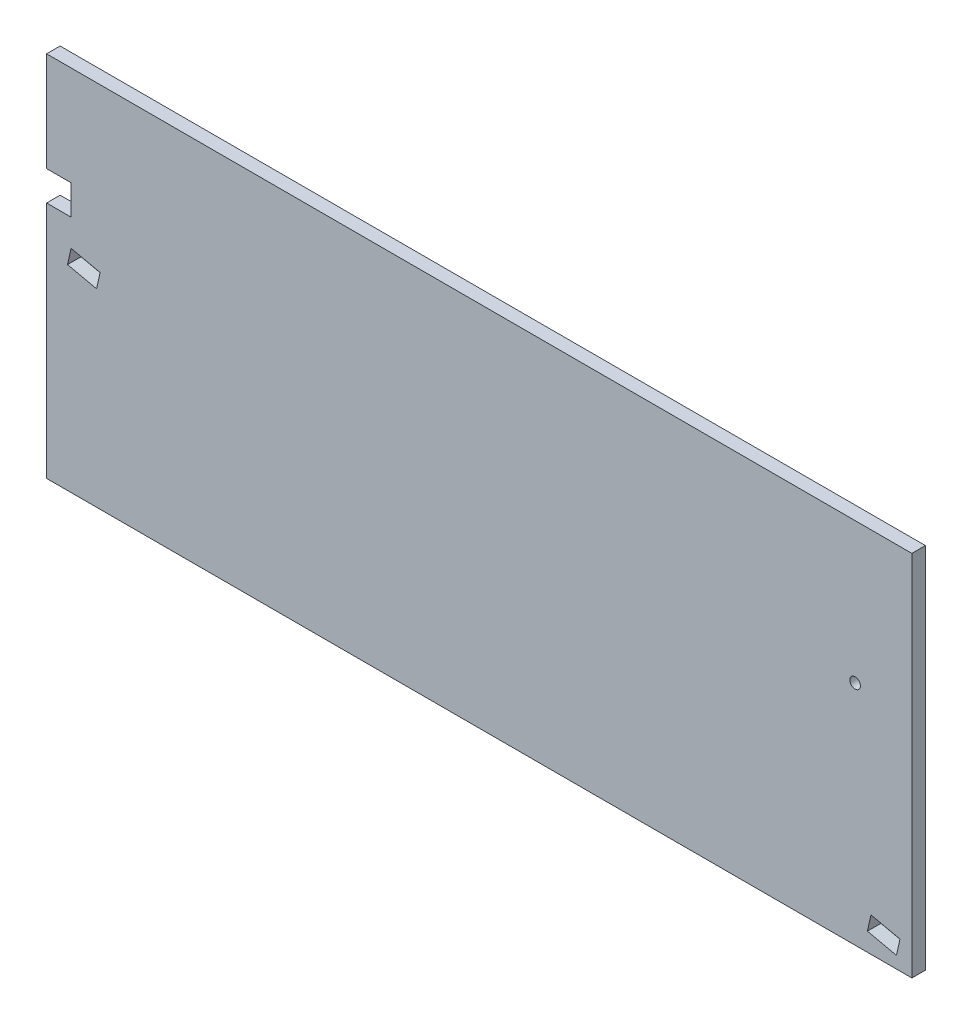
ISO-10303-21;
HEADER;
FILE_DESCRIPTION(('STEP AP214'),'2;1');
FILE_NAME('part.step','',(''),(''),'','','');
FILE_SCHEMA(('AUTOMOTIVE_DESIGN { 1 0 10303 214 1 1 1 1 }'));
ENDSEC;
DATA;
#1=APPLICATION_CONTEXT('core data for automotive mechanical design processes');
#2=APPLICATION_PROTOCOL_DEFINITION('international standard','automotive_design',2000,#1);
#3=PRODUCT_CONTEXT('',#1,'mechanical');
#4=PRODUCT('Part','Part','',(#3));
#5=PRODUCT_RELATED_PRODUCT_CATEGORY('part','',(#4));
#6=PRODUCT_DEFINITION_FORMATION('','',#4);
#7=PRODUCT_DEFINITION_CONTEXT('part definition',#1,'design');
#8=PRODUCT_DEFINITION('design','',#6,#7);
#9=PRODUCT_DEFINITION_SHAPE('','',#8);
#10=(LENGTH_UNIT() NAMED_UNIT(*) SI_UNIT(.MILLI.,.METRE.));
#11=(NAMED_UNIT(*) PLANE_ANGLE_UNIT() SI_UNIT($,.RADIAN.));
#12=(NAMED_UNIT(*) SI_UNIT($,.STERADIAN.) SOLID_ANGLE_UNIT());
#13=UNCERTAINTY_MEASURE_WITH_UNIT(LENGTH_MEASURE(1.E-05),#10,'distance_accuracy_value','');
#14=(GEOMETRIC_REPRESENTATION_CONTEXT(3) GLOBAL_UNCERTAINTY_ASSIGNED_CONTEXT((#13)) GLOBAL_UNIT_ASSIGNED_CONTEXT((#10,
#11,#12)) REPRESENTATION_CONTEXT('',''));
#15=CARTESIAN_POINT('',(0.,0.,0.));
#16=DIRECTION('',(0.,0.,1.));
#17=DIRECTION('',(1.,0.,0.));
#18=AXIS2_PLACEMENT_3D('',#15,#16,#17);
#19=CARTESIAN_POINT('',(-101.6,86.36,3.175));
#20=DIRECTION('',(1.,0.,0.));
#21=DIRECTION('',(0.,0.,-1.));
#22=AXIS2_PLACEMENT_3D('',#19,#20,#21);
#23=PLANE('',#22);
#24=DIRECTION('',(0.,-1.,0.));
#25=VECTOR('',#24,1.);
#26=CARTESIAN_POINT('',(-101.6,86.36,3.175));
#27=LINE('',#26,#25);
#28=CARTESIAN_POINT('',(-101.6,56.0195824102454,3.175));
#29=VERTEX_POINT('',#28);
#30=CARTESIAN_POINT('',(-101.6,0.,3.175));
#31=VERTEX_POINT('',#30);
#32=EDGE_CURVE('E253',#29,#31,#27,.T.);
#33=ORIENTED_EDGE('',*,*,#32,.F.);
#34=DIRECTION('',(0.,0.,1.));
#35=VECTOR('',#34,1.);
#36=CARTESIAN_POINT('',(-101.6,56.0195824102454,0.));
#37=LINE('',#36,#35);
#38=CARTESIAN_POINT('',(-101.6,56.0195824102454,0.));
#39=VERTEX_POINT('',#38);
#40=EDGE_CURVE('E177',#39,#29,#37,.T.);
#41=ORIENTED_EDGE('',*,*,#40,.F.);
#42=DIRECTION('',(0.,-1.,0.));
#43=VECTOR('',#42,1.);
#44=CARTESIAN_POINT('',(-101.6,86.36,0.));
#45=LINE('',#44,#43);
#46=CARTESIAN_POINT('',(-101.6,0.,0.));
#47=VERTEX_POINT('',#46);
#48=EDGE_CURVE('E246',#39,#47,#45,.T.);
#49=ORIENTED_EDGE('',*,*,#48,.T.);
#50=DIRECTION('',(0.,0.,-1.));
#51=VECTOR('',#50,1.);
#52=CARTESIAN_POINT('',(-101.6,0.,3.175));
#53=LINE('',#52,#51);
#54=EDGE_CURVE('E11',#31,#47,#53,.T.);
#55=ORIENTED_EDGE('',*,*,#54,.F.);
#56=EDGE_LOOP('',(#33,#41,#49,#55));
#57=FACE_BOUND('',#56,.T.);
#58=ADVANCED_FACE('F33',(#57),#23,.F.);
#59=CARTESIAN_POINT('',(0.,0.,3.175));
#60=DIRECTION('',(0.,0.,1.));
#61=DIRECTION('',(1.,0.,0.));
#62=AXIS2_PLACEMENT_3D('',#59,#60,#61);
#63=PLANE('',#62);
#64=DIRECTION('',(1.,0.,0.));
#65=VECTOR('',#64,1.);
#66=CARTESIAN_POINT('',(-95.8576608596435,56.0195824102454,3.175));
#67=LINE('',#66,#65);
#68=CARTESIAN_POINT('',(-95.8576608596435,56.0195824102454,3.175));
#69=VERTEX_POINT('',#68);
#70=EDGE_CURVE('E167',#29,#69,#67,.T.);
#71=ORIENTED_EDGE('',*,*,#70,.F.);
#72=ORIENTED_EDGE('',*,*,#32,.T.);
#73=DIRECTION('',(1.,0.,0.));
#74=VECTOR('',#73,1.);
#75=CARTESIAN_POINT('',(-101.6,0.,3.175));
#76=LINE('',#75,#74);
#77=CARTESIAN_POINT('',(101.6,0.,3.175));
#78=VERTEX_POINT('',#77);
#79=EDGE_CURVE('E252',#31,#78,#76,.T.);
#80=ORIENTED_EDGE('',*,*,#79,.T.);
#81=DIRECTION('',(0.,1.,0.));
#82=VECTOR('',#81,1.);
#83=CARTESIAN_POINT('',(101.6,86.36,3.175));
#84=LINE('',#83,#82);
#85=CARTESIAN_POINT('',(101.6,86.36,3.175));
#86=VERTEX_POINT('',#85);
#87=EDGE_CURVE('E255',#78,#86,#84,.T.);
#88=ORIENTED_EDGE('',*,*,#87,.T.);
#89=DIRECTION('',(-1.,0.,0.));
#90=VECTOR('',#89,1.);
#91=CARTESIAN_POINT('',(-101.6,86.36,3.175));
#92=LINE('',#91,#90);
#93=CARTESIAN_POINT('',(-101.6,86.36,3.175));
#94=VERTEX_POINT('',#93);
#95=EDGE_CURVE('E257',#86,#94,#92,.T.);
#96=ORIENTED_EDGE('',*,*,#95,.T.);
#97=CARTESIAN_POINT('',(-101.6,63.0045824102454,3.175));
#98=VERTEX_POINT('',#97);
#99=EDGE_CURVE('E249',#94,#98,#27,.T.);
#100=ORIENTED_EDGE('',*,*,#99,.T.);
#101=DIRECTION('',(-1.,0.,0.));
#102=VECTOR('',#101,1.);
#103=CARTESIAN_POINT('',(-101.6,63.0045824102454,3.175));
#104=LINE('',#103,#102);
#105=CARTESIAN_POINT('',(-95.8576608596435,63.0045824102454,3.175));
#106=VERTEX_POINT('',#105);
#107=EDGE_CURVE('E48',#106,#98,#104,.T.);
#108=ORIENTED_EDGE('',*,*,#107,.F.);
#109=DIRECTION('',(0.,1.,0.));
#110=VECTOR('',#109,1.);
#111=CARTESIAN_POINT('',(-95.8576608596435,63.0045824102454,3.175));
#112=LINE('',#111,#110);
#113=EDGE_CURVE('E153',#69,#106,#112,.T.);
#114=ORIENTED_EDGE('',*,*,#113,.F.);
#115=EDGE_LOOP('',(#71,#72,#80,#88,#96,#100,#108,#114));
#116=FACE_BOUND('',#115,.T.);
#117=DIRECTION('',(-0.976296007119933,0.216439613938103,0.));
#118=VECTOR('',#117,1.);
#119=CARTESIAN_POINT('',(-89.0382332499108,48.1577517068878,3.175));
#120=LINE('',#119,#118);
#121=CARTESIAN_POINT('',(-89.0382332499108,48.1577517068878,3.175));
#122=VERTEX_POINT('',#121);
#123=CARTESIAN_POINT('',(-95.8576608596435,49.6695824102454,3.175));
#124=VERTEX_POINT('',#123);
#125=EDGE_CURVE('E56',#122,#124,#120,.T.);
#126=ORIENTED_EDGE('',*,*,#125,.F.);
#127=DIRECTION('',(0.216439613938103,0.976296007119933,0.));
#128=VECTOR('',#127,1.);
#129=CARTESIAN_POINT('',(-89.862868179015,44.4380639197608,3.175));
#130=LINE('',#129,#128);
#131=CARTESIAN_POINT('',(-89.862868179015,44.4380639197608,3.175));
#132=VERTEX_POINT('',#131);
#133=EDGE_CURVE('E184',#132,#122,#130,.T.);
#134=ORIENTED_EDGE('',*,*,#133,.F.);
#135=DIRECTION('',(0.976296007119933,-0.216439613938103,0.));
#136=VECTOR('',#135,1.);
#137=CARTESIAN_POINT('',(-96.6822957887477,45.9498946231185,3.175));
#138=LINE('',#137,#136);
#139=CARTESIAN_POINT('',(-96.6822957887477,45.9498946231185,3.175));
#140=VERTEX_POINT('',#139);
#141=EDGE_CURVE('E198',#140,#132,#138,.T.);
#142=ORIENTED_EDGE('',*,*,#141,.F.);
#143=DIRECTION('',(-0.216439613938103,-0.976296007119933,0.));
#144=VECTOR('',#143,1.);
#145=CARTESIAN_POINT('',(-95.8576608596435,49.6695824102454,3.175));
#146=LINE('',#145,#144);
#147=EDGE_CURVE('E195',#124,#140,#146,.T.);
#148=ORIENTED_EDGE('',*,*,#147,.F.);
#149=EDGE_LOOP('',(#126,#134,#142,#148));
#150=FACE_BOUND('',#149,.T.);
#151=DIRECTION('',(-0.976296007119933,0.216439613938103,0.));
#152=VECTOR('',#151,1.);
#153=CARTESIAN_POINT('',(98.806,6.51368778712695,3.175));
#154=LINE('',#153,#152);
#155=CARTESIAN_POINT('',(98.806,6.51368778712695,3.175));
#156=VERTEX_POINT('',#155);
#157=CARTESIAN_POINT('',(91.9865723902672,8.0255184904846,3.175));
#158=VERTEX_POINT('',#157);
#159=EDGE_CURVE('E205',#156,#158,#154,.T.);
#160=ORIENTED_EDGE('',*,*,#159,.F.);
#161=DIRECTION('',(0.216439613938103,0.976296007119933,0.));
#162=VECTOR('',#161,1.);
#163=CARTESIAN_POINT('',(97.9813650708958,2.794,3.175));
#164=LINE('',#163,#162);
#165=CARTESIAN_POINT('',(97.9813650708958,2.794,3.175));
#166=VERTEX_POINT('',#165);
#167=EDGE_CURVE('E215',#166,#156,#164,.T.);
#168=ORIENTED_EDGE('',*,*,#167,.F.);
#169=DIRECTION('',(0.976296007119933,-0.216439613938103,0.));
#170=VECTOR('',#169,1.);
#171=CARTESIAN_POINT('',(91.1619374611631,4.30583070335766,3.175));
#172=LINE('',#171,#170);
#173=CARTESIAN_POINT('',(91.1619374611631,4.30583070335766,3.175));
#174=VERTEX_POINT('',#173);
#175=EDGE_CURVE('E229',#174,#166,#172,.T.);
#176=ORIENTED_EDGE('',*,*,#175,.F.);
#177=DIRECTION('',(-0.216439613938103,-0.976296007119933,0.));
#178=VECTOR('',#177,1.);
#179=CARTESIAN_POINT('',(91.9865723902672,8.0255184904846,3.175));
#180=LINE('',#179,#178);
#181=EDGE_CURVE('E226',#158,#174,#180,.T.);
#182=ORIENTED_EDGE('',*,*,#181,.F.);
#183=EDGE_LOOP('',(#160,#168,#176,#182));
#184=FACE_BOUND('',#183,.T.);
#185=CARTESIAN_POINT('',(88.265,53.34,3.175));
#186=DIRECTION('',(0.,0.,1.));
#187=DIRECTION('',(1.,0.,0.));
#188=AXIS2_PLACEMENT_3D('',#185,#186,#187);
#189=CIRCLE('',#188,1.25);
#190=CARTESIAN_POINT('',(89.515,53.34,3.175));
#191=VERTEX_POINT('',#190);
#192=EDGE_CURVE('E243',#191,#191,#189,.T.);
#193=ORIENTED_EDGE('',*,*,#192,.F.);
#194=EDGE_LOOP('',(#193));
#195=FACE_BOUND('',#194,.T.);
#196=ADVANCED_FACE('F291',(#116,#150,#184,#195),#63,.T.);
#197=CARTESIAN_POINT('',(0.,0.,0.));
#198=DIRECTION('',(0.,0.,1.));
#199=DIRECTION('',(1.,0.,0.));
#200=AXIS2_PLACEMENT_3D('',#197,#198,#199);
#201=PLANE('',#200);
#202=DIRECTION('',(0.216439613938103,0.976296007119933,0.));
#203=VECTOR('',#202,1.);
#204=CARTESIAN_POINT('',(-89.862868179015,44.4380639197608,0.));
#205=LINE('',#204,#203);
#206=CARTESIAN_POINT('',(-89.862868179015,44.4380639197608,0.));
#207=VERTEX_POINT('',#206);
#208=CARTESIAN_POINT('',(-89.0382332499108,48.1577517068878,0.));
#209=VERTEX_POINT('',#208);
#210=EDGE_CURVE('E190',#207,#209,#205,.T.);
#211=ORIENTED_EDGE('',*,*,#210,.T.);
#212=DIRECTION('',(-0.976296007119933,0.216439613938103,0.));
#213=VECTOR('',#212,1.);
#214=CARTESIAN_POINT('',(-89.0382332499108,48.1577517068878,0.));
#215=LINE('',#214,#213);
#216=CARTESIAN_POINT('',(-95.8576608596435,49.6695824102454,0.));
#217=VERTEX_POINT('',#216);
#218=EDGE_CURVE('E180',#209,#217,#215,.T.);
#219=ORIENTED_EDGE('',*,*,#218,.T.);
#220=DIRECTION('',(-0.216439613938103,-0.976296007119933,0.));
#221=VECTOR('',#220,1.);
#222=CARTESIAN_POINT('',(-95.8576608596435,49.6695824102454,0.));
#223=LINE('',#222,#221);
#224=CARTESIAN_POINT('',(-96.6822957887477,45.9498946231185,0.));
#225=VERTEX_POINT('',#224);
#226=EDGE_CURVE('E183',#217,#225,#223,.T.);
#227=ORIENTED_EDGE('',*,*,#226,.T.);
#228=DIRECTION('',(0.976296007119933,-0.216439613938103,0.));
#229=VECTOR('',#228,1.);
#230=CARTESIAN_POINT('',(-96.6822957887477,45.9498946231185,0.));
#231=LINE('',#230,#229);
#232=EDGE_CURVE('E187',#225,#207,#231,.T.);
#233=ORIENTED_EDGE('',*,*,#232,.T.);
#234=EDGE_LOOP('',(#211,#219,#227,#233));
#235=FACE_BOUND('',#234,.T.);
#236=DIRECTION('',(0.216439613938103,0.976296007119933,0.));
#237=VECTOR('',#236,1.);
#238=CARTESIAN_POINT('',(97.9813650708958,2.794,0.));
#239=LINE('',#238,#237);
#240=CARTESIAN_POINT('',(97.9813650708958,2.794,0.));
#241=VERTEX_POINT('',#240);
#242=CARTESIAN_POINT('',(98.806,6.51368778712695,0.));
#243=VERTEX_POINT('',#242);
#244=EDGE_CURVE('E221',#241,#243,#239,.T.);
#245=ORIENTED_EDGE('',*,*,#244,.T.);
#246=DIRECTION('',(-0.976296007119933,0.216439613938103,0.));
#247=VECTOR('',#246,1.);
#248=CARTESIAN_POINT('',(98.806,6.51368778712695,0.));
#249=LINE('',#248,#247);
#250=CARTESIAN_POINT('',(91.9865723902672,8.0255184904846,0.));
#251=VERTEX_POINT('',#250);
#252=EDGE_CURVE('E211',#243,#251,#249,.T.);
#253=ORIENTED_EDGE('',*,*,#252,.T.);
#254=DIRECTION('',(-0.216439613938103,-0.976296007119933,0.));
#255=VECTOR('',#254,1.);
#256=CARTESIAN_POINT('',(91.9865723902672,8.0255184904846,0.));
#257=LINE('',#256,#255);
#258=CARTESIAN_POINT('',(91.1619374611631,4.30583070335766,0.));
#259=VERTEX_POINT('',#258);
#260=EDGE_CURVE('E214',#251,#259,#257,.T.);
#261=ORIENTED_EDGE('',*,*,#260,.T.);
#262=DIRECTION('',(0.976296007119933,-0.216439613938103,0.));
#263=VECTOR('',#262,1.);
#264=CARTESIAN_POINT('',(91.1619374611631,4.30583070335766,0.));
#265=LINE('',#264,#263);
#266=EDGE_CURVE('E218',#259,#241,#265,.T.);
#267=ORIENTED_EDGE('',*,*,#266,.T.);
#268=EDGE_LOOP('',(#245,#253,#261,#267));
#269=FACE_BOUND('',#268,.T.);
#270=ORIENTED_EDGE('',*,*,#48,.F.);
#271=DIRECTION('',(1.,0.,0.));
#272=VECTOR('',#271,1.);
#273=CARTESIAN_POINT('',(-95.8576608596435,56.0195824102454,0.));
#274=LINE('',#273,#272);
#275=CARTESIAN_POINT('',(-95.8576608596435,56.0195824102454,0.));
#276=VERTEX_POINT('',#275);
#277=EDGE_CURVE('E155',#39,#276,#274,.T.);
#278=ORIENTED_EDGE('',*,*,#277,.T.);
#279=DIRECTION('',(0.,1.,0.));
#280=VECTOR('',#279,1.);
#281=CARTESIAN_POINT('',(-95.8576608596435,63.0045824102454,0.));
#282=LINE('',#281,#280);
#283=CARTESIAN_POINT('',(-95.8576608596435,63.0045824102454,0.));
#284=VERTEX_POINT('',#283);
#285=EDGE_CURVE('E150',#276,#284,#282,.T.);
#286=ORIENTED_EDGE('',*,*,#285,.T.);
#287=DIRECTION('',(-1.,0.,0.));
#288=VECTOR('',#287,1.);
#289=CARTESIAN_POINT('',(-101.6,63.0045824102454,0.));
#290=LINE('',#289,#288);
#291=CARTESIAN_POINT('',(-101.6,63.0045824102454,0.));
#292=VERTEX_POINT('',#291);
#293=EDGE_CURVE('E158',#284,#292,#290,.T.);
#294=ORIENTED_EDGE('',*,*,#293,.T.);
#295=CARTESIAN_POINT('',(-101.6,86.36,0.));
#296=VERTEX_POINT('',#295);
#297=EDGE_CURVE('E260',#296,#292,#45,.T.);
#298=ORIENTED_EDGE('',*,*,#297,.F.);
#299=DIRECTION('',(-1.,0.,0.));
#300=VECTOR('',#299,1.);
#301=CARTESIAN_POINT('',(-101.6,86.36,0.));
#302=LINE('',#301,#300);
#303=CARTESIAN_POINT('',(101.6,86.36,0.));
#304=VERTEX_POINT('',#303);
#305=EDGE_CURVE('E266',#304,#296,#302,.T.);
#306=ORIENTED_EDGE('',*,*,#305,.F.);
#307=DIRECTION('',(0.,1.,0.));
#308=VECTOR('',#307,1.);
#309=CARTESIAN_POINT('',(101.6,86.36,0.));
#310=LINE('',#309,#308);
#311=CARTESIAN_POINT('',(101.6,0.,0.));
#312=VERTEX_POINT('',#311);
#313=EDGE_CURVE('E264',#312,#304,#310,.T.);
#314=ORIENTED_EDGE('',*,*,#313,.F.);
#315=DIRECTION('',(1.,0.,0.));
#316=VECTOR('',#315,1.);
#317=CARTESIAN_POINT('',(-101.6,0.,0.));
#318=LINE('',#317,#316);
#319=EDGE_CURVE('E262',#47,#312,#318,.T.);
#320=ORIENTED_EDGE('',*,*,#319,.F.);
#321=EDGE_LOOP('',(#270,#278,#286,#294,#298,#306,#314,#320));
#322=FACE_BOUND('',#321,.T.);
#323=CARTESIAN_POINT('',(88.265,53.34,0.));
#324=DIRECTION('',(0.,0.,1.));
#325=DIRECTION('',(1.,0.,0.));
#326=AXIS2_PLACEMENT_3D('',#323,#324,#325);
#327=CIRCLE('',#326,1.25);
#328=CARTESIAN_POINT('',(89.515,53.34,0.));
#329=VERTEX_POINT('',#328);
#330=EDGE_CURVE('E236',#329,#329,#327,.T.);
#331=ORIENTED_EDGE('',*,*,#330,.T.);
#332=EDGE_LOOP('',(#331));
#333=FACE_BOUND('',#332,.T.);
#334=ADVANCED_FACE('F165',(#235,#269,#322,#333),#201,.F.);
#335=ORIENTED_EDGE('',*,*,#297,.T.);
#336=DIRECTION('',(0.,0.,1.));
#337=VECTOR('',#336,1.);
#338=CARTESIAN_POINT('',(-101.6,63.0045824102454,0.));
#339=LINE('',#338,#337);
#340=EDGE_CURVE('E154',#292,#98,#339,.T.);
#341=ORIENTED_EDGE('',*,*,#340,.T.);
#342=ORIENTED_EDGE('',*,*,#99,.F.);
#343=DIRECTION('',(0.,0.,-1.));
#344=VECTOR('',#343,1.);
#345=CARTESIAN_POINT('',(-101.6,86.36,3.175));
#346=LINE('',#345,#344);
#347=EDGE_CURVE('E259',#94,#296,#346,.T.);
#348=ORIENTED_EDGE('',*,*,#347,.T.);
#349=EDGE_LOOP('',(#335,#341,#342,#348));
#350=FACE_BOUND('',#349,.T.);
#351=ADVANCED_FACE('F35',(#350),#23,.F.);
#352=CARTESIAN_POINT('',(-101.6,0.,3.175));
#353=DIRECTION('',(0.,1.,0.));
#354=DIRECTION('',(0.,0.,1.));
#355=AXIS2_PLACEMENT_3D('',#352,#353,#354);
#356=PLANE('',#355);
#357=ORIENTED_EDGE('',*,*,#319,.T.);
#358=DIRECTION('',(0.,0.,-1.));
#359=VECTOR('',#358,1.);
#360=CARTESIAN_POINT('',(101.6,0.,3.175));
#361=LINE('',#360,#359);
#362=EDGE_CURVE('E41',#78,#312,#361,.T.);
#363=ORIENTED_EDGE('',*,*,#362,.F.);
#364=ORIENTED_EDGE('',*,*,#79,.F.);
#365=ORIENTED_EDGE('',*,*,#54,.T.);
#366=EDGE_LOOP('',(#357,#363,#364,#365));
#367=FACE_BOUND('',#366,.T.);
#368=ADVANCED_FACE('F295',(#367),#356,.F.);
#369=CARTESIAN_POINT('',(101.6,86.36,3.175));
#370=DIRECTION('',(-1.,0.,0.));
#371=DIRECTION('',(0.,0.,1.));
#372=AXIS2_PLACEMENT_3D('',#369,#370,#371);
#373=PLANE('',#372);
#374=ORIENTED_EDGE('',*,*,#313,.T.);
#375=DIRECTION('',(0.,0.,-1.));
#376=VECTOR('',#375,1.);
#377=CARTESIAN_POINT('',(101.6,86.36,3.175));
#378=LINE('',#377,#376);
#379=EDGE_CURVE('E270',#86,#304,#378,.T.);
#380=ORIENTED_EDGE('',*,*,#379,.F.);
#381=ORIENTED_EDGE('',*,*,#87,.F.);
#382=ORIENTED_EDGE('',*,*,#362,.T.);
#383=EDGE_LOOP('',(#374,#380,#381,#382));
#384=FACE_BOUND('',#383,.T.);
#385=ADVANCED_FACE('F277',(#384),#373,.F.);
#386=CARTESIAN_POINT('',(-101.6,86.36,3.175));
#387=DIRECTION('',(0.,-1.,0.));
#388=DIRECTION('',(1.,0.,0.));
#389=AXIS2_PLACEMENT_3D('',#386,#387,#388);
#390=PLANE('',#389);
#391=ORIENTED_EDGE('',*,*,#305,.T.);
#392=ORIENTED_EDGE('',*,*,#347,.F.);
#393=ORIENTED_EDGE('',*,*,#95,.F.);
#394=ORIENTED_EDGE('',*,*,#379,.T.);
#395=EDGE_LOOP('',(#391,#392,#393,#394));
#396=FACE_BOUND('',#395,.T.);
#397=ADVANCED_FACE('F285',(#396),#390,.F.);
#398=CARTESIAN_POINT('',(88.265,53.34,3.175));
#399=DIRECTION('',(0.,0.,-1.));
#400=DIRECTION('',(-1.,0.,0.));
#401=AXIS2_PLACEMENT_3D('',#398,#399,#400);
#402=CYLINDRICAL_SURFACE('',#401,1.25);
#403=ORIENTED_EDGE('',*,*,#192,.T.);
#404=EDGE_LOOP('',(#403));
#405=FACE_BOUND('',#404,.T.);
#406=ORIENTED_EDGE('',*,*,#330,.F.);
#407=EDGE_LOOP('',(#406));
#408=FACE_BOUND('',#407,.T.);
#409=ADVANCED_FACE('F328',(#405,#408),#402,.F.);
#410=CARTESIAN_POINT('',(98.806,6.51368778712695,0.));
#411=DIRECTION('',(0.216439613938103,0.976296007119933,0.));
#412=DIRECTION('',(-0.976296007119933,0.216439613938103,0.));
#413=AXIS2_PLACEMENT_3D('',#410,#411,#412);
#414=PLANE('',#413);
#415=ORIENTED_EDGE('',*,*,#159,.T.);
#416=DIRECTION('',(0.,0.,1.));
#417=VECTOR('',#416,1.);
#418=CARTESIAN_POINT('',(91.9865723902672,8.0255184904846,0.));
#419=LINE('',#418,#417);
#420=EDGE_CURVE('E224',#251,#158,#419,.T.);
#421=ORIENTED_EDGE('',*,*,#420,.F.);
#422=ORIENTED_EDGE('',*,*,#252,.F.);
#423=DIRECTION('',(0.,0.,1.));
#424=VECTOR('',#423,1.);
#425=CARTESIAN_POINT('',(98.806,6.51368778712695,0.));
#426=LINE('',#425,#424);
#427=EDGE_CURVE('E234',#243,#156,#426,.T.);
#428=ORIENTED_EDGE('',*,*,#427,.T.);
#429=EDGE_LOOP('',(#415,#421,#422,#428));
#430=FACE_BOUND('',#429,.T.);
#431=ADVANCED_FACE('F344',(#430),#414,.F.);
#432=CARTESIAN_POINT('',(97.9813650708958,2.794,0.));
#433=DIRECTION('',(0.976296007119933,-0.216439613938103,0.));
#434=DIRECTION('',(0.216439613938103,0.976296007119933,0.));
#435=AXIS2_PLACEMENT_3D('',#432,#433,#434);
#436=PLANE('',#435);
#437=ORIENTED_EDGE('',*,*,#167,.T.);
#438=ORIENTED_EDGE('',*,*,#427,.F.);
#439=ORIENTED_EDGE('',*,*,#244,.F.);
#440=DIRECTION('',(0.,0.,1.));
#441=VECTOR('',#440,1.);
#442=CARTESIAN_POINT('',(97.9813650708958,2.794,0.));
#443=LINE('',#442,#441);
#444=EDGE_CURVE('E237',#241,#166,#443,.T.);
#445=ORIENTED_EDGE('',*,*,#444,.T.);
#446=EDGE_LOOP('',(#437,#438,#439,#445));
#447=FACE_BOUND('',#446,.T.);
#448=ADVANCED_FACE('F351',(#447),#436,.F.);
#449=CARTESIAN_POINT('',(91.1619374611631,4.30583070335766,0.));
#450=DIRECTION('',(-0.216439613938103,-0.976296007119933,0.));
#451=DIRECTION('',(0.976296007119933,-0.216439613938104,0.));
#452=AXIS2_PLACEMENT_3D('',#449,#450,#451);
#453=PLANE('',#452);
#454=ORIENTED_EDGE('',*,*,#175,.T.);
#455=ORIENTED_EDGE('',*,*,#444,.F.);
#456=ORIENTED_EDGE('',*,*,#266,.F.);
#457=DIRECTION('',(0.,0.,1.));
#458=VECTOR('',#457,1.);
#459=CARTESIAN_POINT('',(91.1619374611631,4.30583070335766,0.));
#460=LINE('',#459,#458);
#461=EDGE_CURVE('E239',#259,#174,#460,.T.);
#462=ORIENTED_EDGE('',*,*,#461,.T.);
#463=EDGE_LOOP('',(#454,#455,#456,#462));
#464=FACE_BOUND('',#463,.T.);
#465=ADVANCED_FACE('F359',(#464),#453,.F.);
#466=CARTESIAN_POINT('',(91.9865723902672,8.0255184904846,0.));
#467=DIRECTION('',(-0.976296007119933,0.216439613938103,0.));
#468=DIRECTION('',(-0.216439613938103,-0.976296007119933,0.));
#469=AXIS2_PLACEMENT_3D('',#466,#467,#468);
#470=PLANE('',#469);
#471=ORIENTED_EDGE('',*,*,#181,.T.);
#472=ORIENTED_EDGE('',*,*,#461,.F.);
#473=ORIENTED_EDGE('',*,*,#260,.F.);
#474=ORIENTED_EDGE('',*,*,#420,.T.);
#475=EDGE_LOOP('',(#471,#472,#473,#474));
#476=FACE_BOUND('',#475,.T.);
#477=ADVANCED_FACE('F367',(#476),#470,.F.);
#478=CARTESIAN_POINT('',(-89.0382332499108,48.1577517068878,0.));
#479=DIRECTION('',(0.216439613938103,0.976296007119933,0.));
#480=DIRECTION('',(-0.976296007119933,0.216439613938103,0.));
#481=AXIS2_PLACEMENT_3D('',#478,#479,#480);
#482=PLANE('',#481);
#483=ORIENTED_EDGE('',*,*,#125,.T.);
#484=DIRECTION('',(0.,0.,1.));
#485=VECTOR('',#484,1.);
#486=CARTESIAN_POINT('',(-95.8576608596435,49.6695824102454,0.));
#487=LINE('',#486,#485);
#488=EDGE_CURVE('E193',#217,#124,#487,.T.);
#489=ORIENTED_EDGE('',*,*,#488,.F.);
#490=ORIENTED_EDGE('',*,*,#218,.F.);
#491=DIRECTION('',(0.,0.,1.));
#492=VECTOR('',#491,1.);
#493=CARTESIAN_POINT('',(-89.0382332499108,48.1577517068878,0.));
#494=LINE('',#493,#492);
#495=EDGE_CURVE('E203',#209,#122,#494,.T.);
#496=ORIENTED_EDGE('',*,*,#495,.T.);
#497=EDGE_LOOP('',(#483,#489,#490,#496));
#498=FACE_BOUND('',#497,.T.);
#499=ADVANCED_FACE('F375',(#498),#482,.F.);
#500=CARTESIAN_POINT('',(-89.862868179015,44.4380639197608,0.));
#501=DIRECTION('',(0.976296007119933,-0.216439613938103,0.));
#502=DIRECTION('',(0.216439613938103,0.976296007119933,0.));
#503=AXIS2_PLACEMENT_3D('',#500,#501,#502);
#504=PLANE('',#503);
#505=ORIENTED_EDGE('',*,*,#133,.T.);
#506=ORIENTED_EDGE('',*,*,#495,.F.);
#507=ORIENTED_EDGE('',*,*,#210,.F.);
#508=DIRECTION('',(0.,0.,1.));
#509=VECTOR('',#508,1.);
#510=CARTESIAN_POINT('',(-89.862868179015,44.4380639197608,0.));
#511=LINE('',#510,#509);
#512=EDGE_CURVE('E206',#207,#132,#511,.T.);
#513=ORIENTED_EDGE('',*,*,#512,.T.);
#514=EDGE_LOOP('',(#505,#506,#507,#513));
#515=FACE_BOUND('',#514,.T.);
#516=ADVANCED_FACE('F383',(#515),#504,.F.);
#517=CARTESIAN_POINT('',(-96.6822957887477,45.9498946231185,0.));
#518=DIRECTION('',(-0.216439613938103,-0.976296007119933,0.));
#519=DIRECTION('',(0.976296007119933,-0.216439613938104,0.));
#520=AXIS2_PLACEMENT_3D('',#517,#518,#519);
#521=PLANE('',#520);
#522=ORIENTED_EDGE('',*,*,#141,.T.);
#523=ORIENTED_EDGE('',*,*,#512,.F.);
#524=ORIENTED_EDGE('',*,*,#232,.F.);
#525=DIRECTION('',(0.,0.,1.));
#526=VECTOR('',#525,1.);
#527=CARTESIAN_POINT('',(-96.6822957887477,45.9498946231185,0.));
#528=LINE('',#527,#526);
#529=EDGE_CURVE('E208',#225,#140,#528,.T.);
#530=ORIENTED_EDGE('',*,*,#529,.T.);
#531=EDGE_LOOP('',(#522,#523,#524,#530));
#532=FACE_BOUND('',#531,.T.);
#533=ADVANCED_FACE('F390',(#532),#521,.F.);
#534=CARTESIAN_POINT('',(-95.8576608596435,49.6695824102454,0.));
#535=DIRECTION('',(-0.976296007119933,0.216439613938103,0.));
#536=DIRECTION('',(-0.216439613938103,-0.976296007119933,0.));
#537=AXIS2_PLACEMENT_3D('',#534,#535,#536);
#538=PLANE('',#537);
#539=ORIENTED_EDGE('',*,*,#147,.T.);
#540=ORIENTED_EDGE('',*,*,#529,.F.);
#541=ORIENTED_EDGE('',*,*,#226,.F.);
#542=ORIENTED_EDGE('',*,*,#488,.T.);
#543=EDGE_LOOP('',(#539,#540,#541,#542));
#544=FACE_BOUND('',#543,.T.);
#545=ADVANCED_FACE('F307',(#544),#538,.F.);
#546=CARTESIAN_POINT('',(-95.8576608596435,63.0045824102454,0.));
#547=DIRECTION('',(1.,0.,0.));
#548=DIRECTION('',(0.,0.,-1.));
#549=AXIS2_PLACEMENT_3D('',#546,#547,#548);
#550=PLANE('',#549);
#551=ORIENTED_EDGE('',*,*,#113,.T.);
#552=DIRECTION('',(0.,0.,1.));
#553=VECTOR('',#552,1.);
#554=CARTESIAN_POINT('',(-95.8576608596435,63.0045824102454,0.));
#555=LINE('',#554,#553);
#556=EDGE_CURVE('E146',#284,#106,#555,.T.);
#557=ORIENTED_EDGE('',*,*,#556,.F.);
#558=ORIENTED_EDGE('',*,*,#285,.F.);
#559=DIRECTION('',(0.,0.,1.));
#560=VECTOR('',#559,1.);
#561=CARTESIAN_POINT('',(-95.8576608596435,56.0195824102454,0.));
#562=LINE('',#561,#560);
#563=EDGE_CURVE('E175',#276,#69,#562,.T.);
#564=ORIENTED_EDGE('',*,*,#563,.T.);
#565=EDGE_LOOP('',(#551,#557,#558,#564));
#566=FACE_BOUND('',#565,.T.);
#567=ADVANCED_FACE('F148',(#566),#550,.F.);
#568=CARTESIAN_POINT('',(-95.8576608596435,56.0195824102454,0.));
#569=DIRECTION('',(0.,-1.,0.));
#570=DIRECTION('',(0.,0.,-1.));
#571=AXIS2_PLACEMENT_3D('',#568,#569,#570);
#572=PLANE('',#571);
#573=ORIENTED_EDGE('',*,*,#70,.T.);
#574=ORIENTED_EDGE('',*,*,#563,.F.);
#575=ORIENTED_EDGE('',*,*,#277,.F.);
#576=ORIENTED_EDGE('',*,*,#40,.T.);
#577=EDGE_LOOP('',(#573,#574,#575,#576));
#578=FACE_BOUND('',#577,.T.);
#579=ADVANCED_FACE('F299',(#578),#572,.F.);
#580=CARTESIAN_POINT('',(-101.6,63.0045824102454,0.));
#581=DIRECTION('',(0.,1.,0.));
#582=DIRECTION('',(0.,0.,1.));
#583=AXIS2_PLACEMENT_3D('',#580,#581,#582);
#584=PLANE('',#583);
#585=ORIENTED_EDGE('',*,*,#107,.T.);
#586=ORIENTED_EDGE('',*,*,#340,.F.);
#587=ORIENTED_EDGE('',*,*,#293,.F.);
#588=ORIENTED_EDGE('',*,*,#556,.T.);
#589=EDGE_LOOP('',(#585,#586,#587,#588));
#590=FACE_BOUND('',#589,.T.);
#591=ADVANCED_FACE('F159',(#590),#584,.F.);
#592=CLOSED_SHELL('',(#58,#196,#334,#351,#368,#385,#397,#409,#431,#448,#465,#477,#499,#516,#533,
#545,#567,#579,#591));
#593=MANIFOLD_SOLID_BREP('B2',#592);
#594=ADVANCED_BREP_SHAPE_REPRESENTATION('',(#18,#593),#14);
#595=SHAPE_DEFINITION_REPRESENTATION(#9,#594);
ENDSEC;
END-ISO-10303-21;
